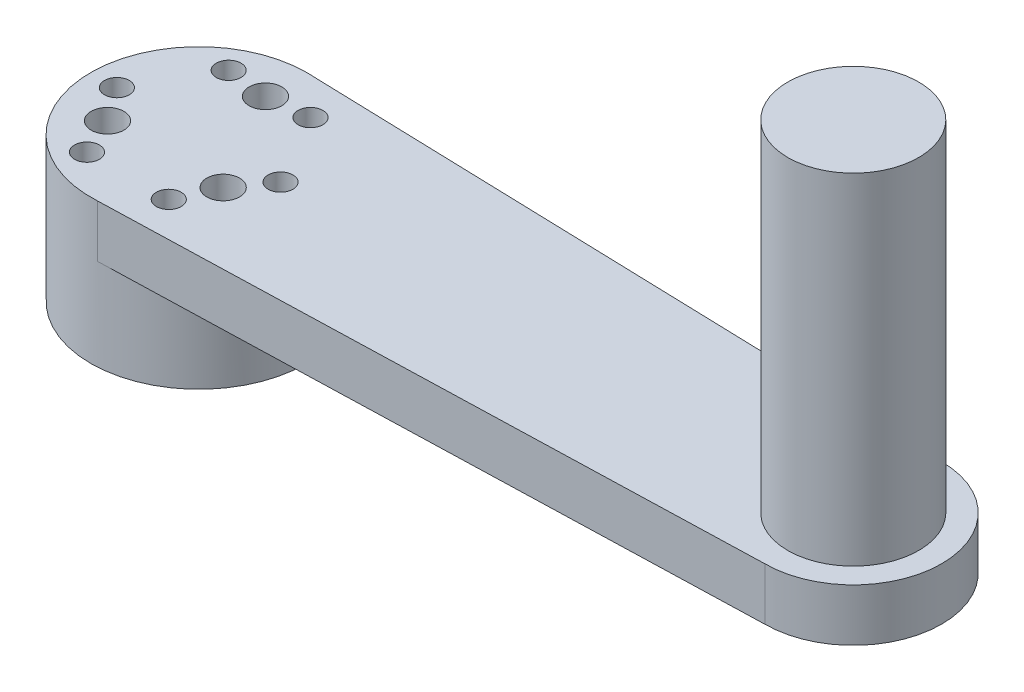
ISO-10303-21;
HEADER;
FILE_DESCRIPTION(('STEP AP214'),'2;1');
FILE_NAME('part.step','',(''),(''),'','','');
FILE_SCHEMA(('AUTOMOTIVE_DESIGN { 1 0 10303 214 1 1 1 1 }'));
ENDSEC;
DATA;
#1=APPLICATION_CONTEXT('core data for automotive mechanical design processes');
#2=APPLICATION_PROTOCOL_DEFINITION('international standard','automotive_design',2000,#1);
#3=PRODUCT_CONTEXT('',#1,'mechanical');
#4=PRODUCT('Part','Part','',(#3));
#5=PRODUCT_RELATED_PRODUCT_CATEGORY('part','',(#4));
#6=PRODUCT_DEFINITION_FORMATION('','',#4);
#7=PRODUCT_DEFINITION_CONTEXT('part definition',#1,'design');
#8=PRODUCT_DEFINITION('design','',#6,#7);
#9=PRODUCT_DEFINITION_SHAPE('','',#8);
#10=(LENGTH_UNIT() NAMED_UNIT(*) SI_UNIT(.MILLI.,.METRE.));
#11=(NAMED_UNIT(*) PLANE_ANGLE_UNIT() SI_UNIT($,.RADIAN.));
#12=(NAMED_UNIT(*) SI_UNIT($,.STERADIAN.) SOLID_ANGLE_UNIT());
#13=UNCERTAINTY_MEASURE_WITH_UNIT(LENGTH_MEASURE(1.E-05),#10,'distance_accuracy_value','');
#14=(GEOMETRIC_REPRESENTATION_CONTEXT(3) GLOBAL_UNCERTAINTY_ASSIGNED_CONTEXT((#13)) GLOBAL_UNIT_ASSIGNED_CONTEXT((#10,
#11,#12)) REPRESENTATION_CONTEXT('',''));
#15=CARTESIAN_POINT('',(0.,0.,0.));
#16=DIRECTION('',(0.,0.,1.));
#17=DIRECTION('',(1.,0.,0.));
#18=AXIS2_PLACEMENT_3D('',#15,#16,#17);
#19=CARTESIAN_POINT('',(0.,0.,0.));
#20=DIRECTION('',(0.,1.,0.));
#21=DIRECTION('',(0.,0.,1.));
#22=AXIS2_PLACEMENT_3D('',#19,#20,#21);
#23=PLANE('',#22);
#24=CARTESIAN_POINT('',(0.,0.,0.));
#25=DIRECTION('',(0.,-1.,0.));
#26=DIRECTION('',(0.,0.,-1.));
#27=AXIS2_PLACEMENT_3D('',#24,#25,#26);
#28=CIRCLE('',#27,16.5);
#29=CARTESIAN_POINT('',(0.989109801178909,0.,-16.4703267059646));
#30=VERTEX_POINT('',#29);
#31=CARTESIAN_POINT('',(0.989109801178909,0.,16.4703267059646));
#32=VERTEX_POINT('',#31);
#33=EDGE_CURVE('E81',#30,#32,#28,.T.);
#34=ORIENTED_EDGE('',*,*,#33,.F.);
#35=DIRECTION('',(-0.999550303522367,0.,-0.029986509105671));
#36=VECTOR('',#35,1.);
#37=CARTESIAN_POINT('',(0.49455490058947,0.,-16.4851633529823));
#38=LINE('',#37,#36);
#39=CARTESIAN_POINT('',(100.,0.,-13.5));
#40=VERTEX_POINT('',#39);
#41=EDGE_CURVE('E84',#40,#30,#38,.T.);
#42=ORIENTED_EDGE('',*,*,#41,.F.);
#43=CARTESIAN_POINT('',(100.,0.,0.));
#44=DIRECTION('',(0.,1.,0.));
#45=DIRECTION('',(0.,0.,1.));
#46=AXIS2_PLACEMENT_3D('',#43,#44,#45);
#47=CIRCLE('',#46,13.5);
#48=CARTESIAN_POINT('',(100.,0.,13.5));
#49=VERTEX_POINT('',#48);
#50=EDGE_CURVE('E101',#49,#40,#47,.T.);
#51=ORIENTED_EDGE('',*,*,#50,.F.);
#52=DIRECTION('',(-0.999550303522367,0.,0.029986509105671));
#53=VECTOR('',#52,1.);
#54=CARTESIAN_POINT('',(0.49455490058947,0.,16.4851633529823));
#55=LINE('',#54,#53);
#56=EDGE_CURVE('E86',#49,#32,#55,.T.);
#57=ORIENTED_EDGE('',*,*,#56,.T.);
#58=EDGE_LOOP('',(#34,#42,#51,#57));
#59=FACE_BOUND('',#58,.T.);
#60=ADVANCED_FACE('F43',(#59),#23,.F.);
#61=CARTESIAN_POINT('',(0.,8.,0.));
#62=DIRECTION('',(0.,-1.,0.));
#63=DIRECTION('',(0.,0.,-1.));
#64=AXIS2_PLACEMENT_3D('',#61,#62,#63);
#65=CYLINDRICAL_SURFACE('',#64,16.5);
#66=DIRECTION('',(0.,-1.,0.));
#67=VECTOR('',#66,1.);
#68=CARTESIAN_POINT('',(0.98910980117891,8.,-16.4703267059646));
#69=LINE('',#68,#67);
#70=CARTESIAN_POINT('',(0.989109801178909,8.,-16.4703267059646));
#71=VERTEX_POINT('',#70);
#72=EDGE_CURVE('E91',#71,#30,#69,.T.);
#73=ORIENTED_EDGE('',*,*,#72,.T.);
#74=ORIENTED_EDGE('',*,*,#33,.T.);
#75=DIRECTION('',(0.,-1.,0.));
#76=VECTOR('',#75,1.);
#77=CARTESIAN_POINT('',(0.98910980117891,8.,16.4703267059646));
#78=LINE('',#77,#76);
#79=CARTESIAN_POINT('',(0.989109801178909,8.,16.4703267059646));
#80=VERTEX_POINT('',#79);
#81=EDGE_CURVE('E61',#80,#32,#78,.T.);
#82=ORIENTED_EDGE('',*,*,#81,.F.);
#83=CARTESIAN_POINT('',(0.,8.,0.));
#84=DIRECTION('',(0.,1.,0.));
#85=DIRECTION('',(0.,0.,1.));
#86=AXIS2_PLACEMENT_3D('',#83,#84,#85);
#87=CIRCLE('',#86,16.5);
#88=EDGE_CURVE('E11',#71,#80,#87,.T.);
#89=ORIENTED_EDGE('',*,*,#88,.F.);
#90=EDGE_LOOP('',(#73,#74,#82,#89));
#91=FACE_BOUND('',#90,.T.);
#92=CARTESIAN_POINT('',(0.,-14.,0.));
#93=DIRECTION('',(0.,-1.,0.));
#94=DIRECTION('',(0.,0.,-1.));
#95=AXIS2_PLACEMENT_3D('',#92,#93,#94);
#96=CIRCLE('',#95,16.5);
#97=CARTESIAN_POINT('',(0.,-14.,-16.5));
#98=VERTEX_POINT('',#97);
#99=EDGE_CURVE('E87',#98,#98,#96,.T.);
#100=ORIENTED_EDGE('',*,*,#99,.F.);
#101=EDGE_LOOP('',(#100));
#102=FACE_BOUND('',#101,.T.);
#103=ADVANCED_FACE('F45',(#91,#102),#65,.T.);
#104=CARTESIAN_POINT('',(0.,8.,0.));
#105=DIRECTION('',(0.,1.,0.));
#106=DIRECTION('',(0.,0.,1.));
#107=AXIS2_PLACEMENT_3D('',#104,#105,#106);
#108=PLANE('',#107);
#109=CARTESIAN_POINT('',(6.25000000000001,8.,-10.8253175473055));
#110=DIRECTION('',(0.,1.,0.));
#111=DIRECTION('',(0.,0.,1.));
#112=AXIS2_PLACEMENT_3D('',#109,#110,#111);
#113=CIRCLE('',#112,1.9);
#114=CARTESIAN_POINT('',(6.25000000000001,8.,-8.92531754730548));
#115=VERTEX_POINT('',#114);
#116=EDGE_CURVE('E51',#115,#115,#113,.T.);
#117=ORIENTED_EDGE('',*,*,#116,.F.);
#118=EDGE_LOOP('',(#117));
#119=FACE_BOUND('',#118,.T.);
#120=CARTESIAN_POINT('',(12.5,8.,0.));
#121=DIRECTION('',(0.,1.,0.));
#122=DIRECTION('',(0.,0.,1.));
#123=AXIS2_PLACEMENT_3D('',#120,#121,#122);
#124=CIRCLE('',#123,1.9);
#125=CARTESIAN_POINT('',(12.5,8.,1.90000000000004));
#126=VERTEX_POINT('',#125);
#127=EDGE_CURVE('E135',#126,#126,#124,.T.);
#128=ORIENTED_EDGE('',*,*,#127,.F.);
#129=EDGE_LOOP('',(#128));
#130=FACE_BOUND('',#129,.T.);
#131=CARTESIAN_POINT('',(8.83345911860192,8.,5.09999999999962));
#132=DIRECTION('',(0.,1.,0.));
#133=DIRECTION('',(0.,0.,1.));
#134=AXIS2_PLACEMENT_3D('',#131,#132,#133);
#135=CIRCLE('',#134,2.5);
#136=CARTESIAN_POINT('',(8.83345911860192,8.,7.59999999999962));
#137=VERTEX_POINT('',#136);
#138=EDGE_CURVE('E132',#137,#137,#135,.T.);
#139=ORIENTED_EDGE('',*,*,#138,.F.);
#140=EDGE_LOOP('',(#139));
#141=FACE_BOUND('',#140,.T.);
#142=CARTESIAN_POINT('',(6.24999999999994,8.,10.8253175473055));
#143=DIRECTION('',(0.,1.,0.));
#144=DIRECTION('',(0.,0.,1.));
#145=AXIS2_PLACEMENT_3D('',#142,#143,#144);
#146=CIRCLE('',#145,1.9);
#147=CARTESIAN_POINT('',(6.24999999999994,8.,12.7253175473055));
#148=VERTEX_POINT('',#147);
#149=EDGE_CURVE('E129',#148,#148,#146,.T.);
#150=ORIENTED_EDGE('',*,*,#149,.F.);
#151=EDGE_LOOP('',(#150));
#152=FACE_BOUND('',#151,.T.);
#153=CARTESIAN_POINT('',(-6.25000000000009,8.,10.8253175473054));
#154=DIRECTION('',(0.,1.,0.));
#155=DIRECTION('',(0.,0.,1.));
#156=AXIS2_PLACEMENT_3D('',#153,#154,#155);
#157=CIRCLE('',#156,1.9);
#158=CARTESIAN_POINT('',(-6.25000000000009,8.,12.7253175473054));
#159=VERTEX_POINT('',#158);
#160=EDGE_CURVE('E126',#159,#159,#157,.T.);
#161=ORIENTED_EDGE('',*,*,#160,.F.);
#162=EDGE_LOOP('',(#161));
#163=FACE_BOUND('',#162,.T.);
#164=CARTESIAN_POINT('',(-8.83345911860063,8.,5.10000000000037));
#165=DIRECTION('',(0.,1.,0.));
#166=DIRECTION('',(0.,0.,1.));
#167=AXIS2_PLACEMENT_3D('',#164,#165,#166);
#168=CIRCLE('',#167,2.5);
#169=CARTESIAN_POINT('',(-8.83345911860063,8.,7.60000000000037));
#170=VERTEX_POINT('',#169);
#171=EDGE_CURVE('E123',#170,#170,#168,.T.);
#172=ORIENTED_EDGE('',*,*,#171,.F.);
#173=EDGE_LOOP('',(#172));
#174=FACE_BOUND('',#173,.T.);
#175=CARTESIAN_POINT('',(0.,8.,-10.2));
#176=DIRECTION('',(0.,1.,0.));
#177=DIRECTION('',(0.,0.,1.));
#178=AXIS2_PLACEMENT_3D('',#175,#176,#177);
#179=CIRCLE('',#178,2.5);
#180=CARTESIAN_POINT('',(0.,8.,-7.7));
#181=VERTEX_POINT('',#180);
#182=EDGE_CURVE('E120',#181,#181,#179,.T.);
#183=ORIENTED_EDGE('',*,*,#182,.F.);
#184=EDGE_LOOP('',(#183));
#185=FACE_BOUND('',#184,.T.);
#186=CARTESIAN_POINT('',(-6.25000000000002,8.,-10.8253175473055));
#187=DIRECTION('',(0.,1.,0.));
#188=DIRECTION('',(0.,0.,1.));
#189=AXIS2_PLACEMENT_3D('',#186,#187,#188);
#190=CIRCLE('',#189,1.9);
#191=CARTESIAN_POINT('',(-6.25000000000002,8.,-8.92531754730548));
#192=VERTEX_POINT('',#191);
#193=EDGE_CURVE('E117',#192,#192,#190,.T.);
#194=ORIENTED_EDGE('',*,*,#193,.F.);
#195=EDGE_LOOP('',(#194));
#196=FACE_BOUND('',#195,.T.);
#197=CARTESIAN_POINT('',(-12.5,8.,-1.27502175484295E-13));
#198=DIRECTION('',(0.,1.,0.));
#199=DIRECTION('',(0.,0.,1.));
#200=AXIS2_PLACEMENT_3D('',#197,#198,#199);
#201=CIRCLE('',#200,1.9);
#202=CARTESIAN_POINT('',(-12.5,8.,1.89999999999987));
#203=VERTEX_POINT('',#202);
#204=EDGE_CURVE('E114',#203,#203,#201,.T.);
#205=ORIENTED_EDGE('',*,*,#204,.F.);
#206=EDGE_LOOP('',(#205));
#207=FACE_BOUND('',#206,.T.);
#208=ORIENTED_EDGE('',*,*,#88,.T.);
#209=DIRECTION('',(-0.999550303522367,0.,0.029986509105671));
#210=VECTOR('',#209,1.);
#211=CARTESIAN_POINT('',(0.49455490058947,8.,16.4851633529823));
#212=LINE('',#211,#210);
#213=CARTESIAN_POINT('',(100.,8.,13.5));
#214=VERTEX_POINT('',#213);
#215=EDGE_CURVE('E100',#214,#80,#212,.T.);
#216=ORIENTED_EDGE('',*,*,#215,.F.);
#217=CARTESIAN_POINT('',(100.,8.,0.));
#218=DIRECTION('',(0.,1.,0.));
#219=DIRECTION('',(0.,0.,1.));
#220=AXIS2_PLACEMENT_3D('',#217,#218,#219);
#221=CIRCLE('',#220,13.5);
#222=CARTESIAN_POINT('',(100.,8.,-13.5));
#223=VERTEX_POINT('',#222);
#224=EDGE_CURVE('E104',#214,#223,#221,.T.);
#225=ORIENTED_EDGE('',*,*,#224,.T.);
#226=DIRECTION('',(-0.999550303522367,0.,-0.029986509105671));
#227=VECTOR('',#226,1.);
#228=CARTESIAN_POINT('',(0.49455490058947,8.,-16.4851633529823));
#229=LINE('',#228,#227);
#230=EDGE_CURVE('E169',#223,#71,#229,.T.);
#231=ORIENTED_EDGE('',*,*,#230,.T.);
#232=EDGE_LOOP('',(#208,#216,#225,#231));
#233=FACE_BOUND('',#232,.T.);
#234=CARTESIAN_POINT('',(100.,8.,0.));
#235=DIRECTION('',(0.,1.,0.));
#236=DIRECTION('',(0.,0.,1.));
#237=AXIS2_PLACEMENT_3D('',#234,#235,#236);
#238=CIRCLE('',#237,10.);
#239=CARTESIAN_POINT('',(100.,8.,10.));
#240=VERTEX_POINT('',#239);
#241=EDGE_CURVE('E109',#240,#240,#238,.T.);
#242=ORIENTED_EDGE('',*,*,#241,.F.);
#243=EDGE_LOOP('',(#242));
#244=FACE_BOUND('',#243,.T.);
#245=ADVANCED_FACE('F143',(#119,#130,#141,#152,#163,#174,#185,#196,#207,#233,#244),#108,.T.);
#246=CARTESIAN_POINT('',(-12.5,0.,-1.27502175484295E-13));
#247=DIRECTION('',(0.,1.,0.));
#248=DIRECTION('',(0.,0.,1.));
#249=AXIS2_PLACEMENT_3D('',#246,#247,#248);
#250=CYLINDRICAL_SURFACE('',#249,1.9);
#251=ORIENTED_EDGE('',*,*,#204,.T.);
#252=EDGE_LOOP('',(#251));
#253=FACE_BOUND('',#252,.T.);
#254=CARTESIAN_POINT('',(-12.5,-14.,-1.27502175484295E-13));
#255=DIRECTION('',(0.,-1.,0.));
#256=DIRECTION('',(0.,0.,-1.));
#257=AXIS2_PLACEMENT_3D('',#254,#255,#256);
#258=CIRCLE('',#257,1.9);
#259=CARTESIAN_POINT('',(-12.5,-14.,-1.90000000000013));
#260=VERTEX_POINT('',#259);
#261=EDGE_CURVE('E237',#260,#260,#258,.T.);
#262=ORIENTED_EDGE('',*,*,#261,.T.);
#263=EDGE_LOOP('',(#262));
#264=FACE_BOUND('',#263,.T.);
#265=ADVANCED_FACE('F146',(#253,#264),#250,.F.);
#266=CARTESIAN_POINT('',(-6.25000000000002,0.,-10.8253175473055));
#267=DIRECTION('',(0.,1.,0.));
#268=DIRECTION('',(0.,0.,1.));
#269=AXIS2_PLACEMENT_3D('',#266,#267,#268);
#270=CYLINDRICAL_SURFACE('',#269,1.9);
#271=ORIENTED_EDGE('',*,*,#193,.T.);
#272=EDGE_LOOP('',(#271));
#273=FACE_BOUND('',#272,.T.);
#274=CARTESIAN_POINT('',(-6.25000000000002,-14.,-10.8253175473055));
#275=DIRECTION('',(0.,-1.,0.));
#276=DIRECTION('',(0.,0.,-1.));
#277=AXIS2_PLACEMENT_3D('',#274,#275,#276);
#278=CIRCLE('',#277,1.9);
#279=CARTESIAN_POINT('',(-6.25000000000002,-14.,-12.7253175473055));
#280=VERTEX_POINT('',#279);
#281=EDGE_CURVE('E235',#280,#280,#278,.T.);
#282=ORIENTED_EDGE('',*,*,#281,.T.);
#283=EDGE_LOOP('',(#282));
#284=FACE_BOUND('',#283,.T.);
#285=ADVANCED_FACE('F203',(#273,#284),#270,.F.);
#286=CARTESIAN_POINT('',(0.,0.,-10.2));
#287=DIRECTION('',(0.,1.,0.));
#288=DIRECTION('',(0.,0.,1.));
#289=AXIS2_PLACEMENT_3D('',#286,#287,#288);
#290=CYLINDRICAL_SURFACE('',#289,2.5);
#291=ORIENTED_EDGE('',*,*,#182,.T.);
#292=EDGE_LOOP('',(#291));
#293=FACE_BOUND('',#292,.T.);
#294=CARTESIAN_POINT('',(0.,-14.,-10.2));
#295=DIRECTION('',(0.,-1.,0.));
#296=DIRECTION('',(0.,0.,-1.));
#297=AXIS2_PLACEMENT_3D('',#294,#295,#296);
#298=CIRCLE('',#297,2.5);
#299=CARTESIAN_POINT('',(0.,-14.,-12.7));
#300=VERTEX_POINT('',#299);
#301=EDGE_CURVE('E238',#300,#300,#298,.T.);
#302=ORIENTED_EDGE('',*,*,#301,.T.);
#303=EDGE_LOOP('',(#302));
#304=FACE_BOUND('',#303,.T.);
#305=ADVANCED_FACE('F224',(#293,#304),#290,.F.);
#306=CARTESIAN_POINT('',(-8.83345911860063,0.,5.10000000000037));
#307=DIRECTION('',(0.,1.,0.));
#308=DIRECTION('',(0.,0.,1.));
#309=AXIS2_PLACEMENT_3D('',#306,#307,#308);
#310=CYLINDRICAL_SURFACE('',#309,2.5);
#311=ORIENTED_EDGE('',*,*,#171,.T.);
#312=EDGE_LOOP('',(#311));
#313=FACE_BOUND('',#312,.T.);
#314=CARTESIAN_POINT('',(-8.83345911860063,-14.,5.10000000000037));
#315=DIRECTION('',(0.,-1.,0.));
#316=DIRECTION('',(0.,0.,-1.));
#317=AXIS2_PLACEMENT_3D('',#314,#315,#316);
#318=CIRCLE('',#317,2.5);
#319=CARTESIAN_POINT('',(-8.83345911860063,-14.,2.60000000000037));
#320=VERTEX_POINT('',#319);
#321=EDGE_CURVE('E88',#320,#320,#318,.T.);
#322=ORIENTED_EDGE('',*,*,#321,.T.);
#323=EDGE_LOOP('',(#322));
#324=FACE_BOUND('',#323,.T.);
#325=ADVANCED_FACE('F220',(#313,#324),#310,.F.);
#326=CARTESIAN_POINT('',(-6.25000000000009,0.,10.8253175473054));
#327=DIRECTION('',(0.,1.,0.));
#328=DIRECTION('',(0.,0.,1.));
#329=AXIS2_PLACEMENT_3D('',#326,#327,#328);
#330=CYLINDRICAL_SURFACE('',#329,1.9);
#331=ORIENTED_EDGE('',*,*,#160,.T.);
#332=EDGE_LOOP('',(#331));
#333=FACE_BOUND('',#332,.T.);
#334=CARTESIAN_POINT('',(-6.25000000000009,-14.,10.8253175473054));
#335=DIRECTION('',(0.,-1.,0.));
#336=DIRECTION('',(0.,0.,-1.));
#337=AXIS2_PLACEMENT_3D('',#334,#335,#336);
#338=CIRCLE('',#337,1.9);
#339=CARTESIAN_POINT('',(-6.25000000000009,-14.,8.92531754730544));
#340=VERTEX_POINT('',#339);
#341=EDGE_CURVE('E439',#340,#340,#338,.T.);
#342=ORIENTED_EDGE('',*,*,#341,.T.);
#343=EDGE_LOOP('',(#342));
#344=FACE_BOUND('',#343,.T.);
#345=ADVANCED_FACE('F216',(#333,#344),#330,.F.);
#346=CARTESIAN_POINT('',(6.24999999999994,0.,10.8253175473055));
#347=DIRECTION('',(0.,1.,0.));
#348=DIRECTION('',(0.,0.,1.));
#349=AXIS2_PLACEMENT_3D('',#346,#347,#348);
#350=CYLINDRICAL_SURFACE('',#349,1.9);
#351=ORIENTED_EDGE('',*,*,#149,.T.);
#352=EDGE_LOOP('',(#351));
#353=FACE_BOUND('',#352,.T.);
#354=CARTESIAN_POINT('',(6.24999999999994,-14.,10.8253175473055));
#355=DIRECTION('',(0.,-1.,0.));
#356=DIRECTION('',(0.,0.,-1.));
#357=AXIS2_PLACEMENT_3D('',#354,#355,#356);
#358=CIRCLE('',#357,1.9);
#359=CARTESIAN_POINT('',(6.24999999999994,-14.,8.92531754730552));
#360=VERTEX_POINT('',#359);
#361=EDGE_CURVE('E436',#360,#360,#358,.T.);
#362=ORIENTED_EDGE('',*,*,#361,.T.);
#363=EDGE_LOOP('',(#362));
#364=FACE_BOUND('',#363,.T.);
#365=ADVANCED_FACE('F212',(#353,#364),#350,.F.);
#366=CARTESIAN_POINT('',(8.83345911860192,0.,5.09999999999962));
#367=DIRECTION('',(0.,1.,0.));
#368=DIRECTION('',(0.,0.,1.));
#369=AXIS2_PLACEMENT_3D('',#366,#367,#368);
#370=CYLINDRICAL_SURFACE('',#369,2.5);
#371=ORIENTED_EDGE('',*,*,#138,.T.);
#372=EDGE_LOOP('',(#371));
#373=FACE_BOUND('',#372,.T.);
#374=CARTESIAN_POINT('',(8.83345911860192,-14.,5.09999999999962));
#375=DIRECTION('',(0.,-1.,0.));
#376=DIRECTION('',(0.,0.,-1.));
#377=AXIS2_PLACEMENT_3D('',#374,#375,#376);
#378=CIRCLE('',#377,2.5);
#379=CARTESIAN_POINT('',(8.83345911860192,-14.,2.59999999999962));
#380=VERTEX_POINT('',#379);
#381=EDGE_CURVE('E432',#380,#380,#378,.T.);
#382=ORIENTED_EDGE('',*,*,#381,.T.);
#383=EDGE_LOOP('',(#382));
#384=FACE_BOUND('',#383,.T.);
#385=ADVANCED_FACE('F208',(#373,#384),#370,.F.);
#386=CARTESIAN_POINT('',(12.5,0.,0.));
#387=DIRECTION('',(0.,1.,0.));
#388=DIRECTION('',(0.,0.,1.));
#389=AXIS2_PLACEMENT_3D('',#386,#387,#388);
#390=CYLINDRICAL_SURFACE('',#389,1.9);
#391=ORIENTED_EDGE('',*,*,#127,.T.);
#392=EDGE_LOOP('',(#391));
#393=FACE_BOUND('',#392,.T.);
#394=CARTESIAN_POINT('',(12.5,-14.,0.));
#395=DIRECTION('',(0.,-1.,0.));
#396=DIRECTION('',(0.,0.,-1.));
#397=AXIS2_PLACEMENT_3D('',#394,#395,#396);
#398=CIRCLE('',#397,1.9);
#399=CARTESIAN_POINT('',(12.5,-14.,-1.89999999999996));
#400=VERTEX_POINT('',#399);
#401=EDGE_CURVE('E249',#400,#400,#398,.T.);
#402=ORIENTED_EDGE('',*,*,#401,.T.);
#403=EDGE_LOOP('',(#402));
#404=FACE_BOUND('',#403,.T.);
#405=ADVANCED_FACE('F194',(#393,#404),#390,.F.);
#406=CARTESIAN_POINT('',(6.25000000000001,0.,-10.8253175473055));
#407=DIRECTION('',(0.,1.,0.));
#408=DIRECTION('',(0.,0.,1.));
#409=AXIS2_PLACEMENT_3D('',#406,#407,#408);
#410=CYLINDRICAL_SURFACE('',#409,1.9);
#411=ORIENTED_EDGE('',*,*,#116,.T.);
#412=EDGE_LOOP('',(#411));
#413=FACE_BOUND('',#412,.T.);
#414=CARTESIAN_POINT('',(6.25000000000001,-14.,-10.8253175473055));
#415=DIRECTION('',(0.,-1.,0.));
#416=DIRECTION('',(0.,0.,-1.));
#417=AXIS2_PLACEMENT_3D('',#414,#415,#416);
#418=CIRCLE('',#417,1.9);
#419=CARTESIAN_POINT('',(6.25000000000001,-14.,-12.7253175473055));
#420=VERTEX_POINT('',#419);
#421=EDGE_CURVE('E243',#420,#420,#418,.T.);
#422=ORIENTED_EDGE('',*,*,#421,.T.);
#423=EDGE_LOOP('',(#422));
#424=FACE_BOUND('',#423,.T.);
#425=ADVANCED_FACE('F140',(#413,#424),#410,.F.);
#426=CARTESIAN_POINT('',(0.49455490058947,8.,16.4851633529823));
#427=DIRECTION('',(0.029986509105671,0.,0.999550303522367));
#428=DIRECTION('',(0.999550303522367,0.,-0.029986509105671));
#429=AXIS2_PLACEMENT_3D('',#426,#427,#428);
#430=PLANE('',#429);
#431=ORIENTED_EDGE('',*,*,#56,.F.);
#432=DIRECTION('',(0.,-1.,0.));
#433=VECTOR('',#432,1.);
#434=CARTESIAN_POINT('',(100.,8.,13.5));
#435=LINE('',#434,#433);
#436=EDGE_CURVE('E112',#214,#49,#435,.T.);
#437=ORIENTED_EDGE('',*,*,#436,.F.);
#438=ORIENTED_EDGE('',*,*,#215,.T.);
#439=ORIENTED_EDGE('',*,*,#81,.T.);
#440=EDGE_LOOP('',(#431,#437,#438,#439));
#441=FACE_BOUND('',#440,.T.);
#442=ADVANCED_FACE('F184',(#441),#430,.T.);
#443=CARTESIAN_POINT('',(100.,8.,0.));
#444=DIRECTION('',(0.,-1.,0.));
#445=DIRECTION('',(0.,0.,-1.));
#446=AXIS2_PLACEMENT_3D('',#443,#444,#445);
#447=CYLINDRICAL_SURFACE('',#446,13.5);
#448=ORIENTED_EDGE('',*,*,#50,.T.);
#449=DIRECTION('',(0.,-1.,0.));
#450=VECTOR('',#449,1.);
#451=CARTESIAN_POINT('',(100.,8.,-13.5));
#452=LINE('',#451,#450);
#453=EDGE_CURVE('E95',#223,#40,#452,.T.);
#454=ORIENTED_EDGE('',*,*,#453,.F.);
#455=ORIENTED_EDGE('',*,*,#224,.F.);
#456=ORIENTED_EDGE('',*,*,#436,.T.);
#457=EDGE_LOOP('',(#448,#454,#455,#456));
#458=FACE_BOUND('',#457,.T.);
#459=ADVANCED_FACE('F182',(#458),#447,.T.);
#460=CARTESIAN_POINT('',(0.49455490058947,8.,-16.4851633529823));
#461=DIRECTION('',(-0.029986509105671,0.,0.999550303522367));
#462=DIRECTION('',(0.999550303522367,0.,0.029986509105671));
#463=AXIS2_PLACEMENT_3D('',#460,#461,#462);
#464=PLANE('',#463);
#465=ORIENTED_EDGE('',*,*,#41,.T.);
#466=ORIENTED_EDGE('',*,*,#72,.F.);
#467=ORIENTED_EDGE('',*,*,#230,.F.);
#468=ORIENTED_EDGE('',*,*,#453,.T.);
#469=EDGE_LOOP('',(#465,#466,#467,#468));
#470=FACE_BOUND('',#469,.T.);
#471=ADVANCED_FACE('F98',(#470),#464,.F.);
#472=CARTESIAN_POINT('',(100.,60.,0.));
#473=DIRECTION('',(0.,-1.,0.));
#474=DIRECTION('',(0.,0.,-1.));
#475=AXIS2_PLACEMENT_3D('',#472,#473,#474);
#476=CYLINDRICAL_SURFACE('',#475,10.);
#477=ORIENTED_EDGE('',*,*,#241,.T.);
#478=EDGE_LOOP('',(#477));
#479=FACE_BOUND('',#478,.T.);
#480=CARTESIAN_POINT('',(100.,60.,0.));
#481=DIRECTION('',(0.,1.,0.));
#482=DIRECTION('',(0.,0.,1.));
#483=AXIS2_PLACEMENT_3D('',#480,#481,#482);
#484=CIRCLE('',#483,10.);
#485=CARTESIAN_POINT('',(100.,60.,10.));
#486=VERTEX_POINT('',#485);
#487=EDGE_CURVE('E173',#486,#486,#484,.T.);
#488=ORIENTED_EDGE('',*,*,#487,.F.);
#489=EDGE_LOOP('',(#488));
#490=FACE_BOUND('',#489,.T.);
#491=ADVANCED_FACE('F263',(#479,#490),#476,.T.);
#492=CARTESIAN_POINT('',(0.,60.,0.));
#493=DIRECTION('',(0.,1.,0.));
#494=DIRECTION('',(0.,0.,1.));
#495=AXIS2_PLACEMENT_3D('',#492,#493,#494);
#496=PLANE('',#495);
#497=ORIENTED_EDGE('',*,*,#487,.T.);
#498=EDGE_LOOP('',(#497));
#499=FACE_BOUND('',#498,.T.);
#500=ADVANCED_FACE('F257',(#499),#496,.T.);
#501=CARTESIAN_POINT('',(0.,-14.,0.));
#502=DIRECTION('',(0.,-1.,0.));
#503=DIRECTION('',(0.,0.,-1.));
#504=AXIS2_PLACEMENT_3D('',#501,#502,#503);
#505=PLANE('',#504);
#506=ORIENTED_EDGE('',*,*,#261,.F.);
#507=EDGE_LOOP('',(#506));
#508=FACE_BOUND('',#507,.T.);
#509=ORIENTED_EDGE('',*,*,#281,.F.);
#510=EDGE_LOOP('',(#509));
#511=FACE_BOUND('',#510,.T.);
#512=ORIENTED_EDGE('',*,*,#301,.F.);
#513=EDGE_LOOP('',(#512));
#514=FACE_BOUND('',#513,.T.);
#515=ORIENTED_EDGE('',*,*,#421,.F.);
#516=EDGE_LOOP('',(#515));
#517=FACE_BOUND('',#516,.T.);
#518=ORIENTED_EDGE('',*,*,#401,.F.);
#519=EDGE_LOOP('',(#518));
#520=FACE_BOUND('',#519,.T.);
#521=ORIENTED_EDGE('',*,*,#381,.F.);
#522=EDGE_LOOP('',(#521));
#523=FACE_BOUND('',#522,.T.);
#524=ORIENTED_EDGE('',*,*,#361,.F.);
#525=EDGE_LOOP('',(#524));
#526=FACE_BOUND('',#525,.T.);
#527=ORIENTED_EDGE('',*,*,#341,.F.);
#528=EDGE_LOOP('',(#527));
#529=FACE_BOUND('',#528,.T.);
#530=ORIENTED_EDGE('',*,*,#321,.F.);
#531=EDGE_LOOP('',(#530));
#532=FACE_BOUND('',#531,.T.);
#533=ORIENTED_EDGE('',*,*,#99,.T.);
#534=EDGE_LOOP('',(#533));
#535=FACE_BOUND('',#534,.T.);
#536=ADVANCED_FACE('F254',(#508,#511,#514,#517,#520,#523,#526,#529,#532,#535),#505,.T.);
#537=CLOSED_SHELL('',(#60,#103,#245,#265,#285,#305,#325,#345,#365,#385,#405,#425,#442,#459,#471,
#491,#500,#536));
#538=MANIFOLD_SOLID_BREP('B2',#537);
#539=ADVANCED_BREP_SHAPE_REPRESENTATION('',(#18,#538),#14);
#540=SHAPE_DEFINITION_REPRESENTATION(#9,#539);
ENDSEC;
END-ISO-10303-21;
